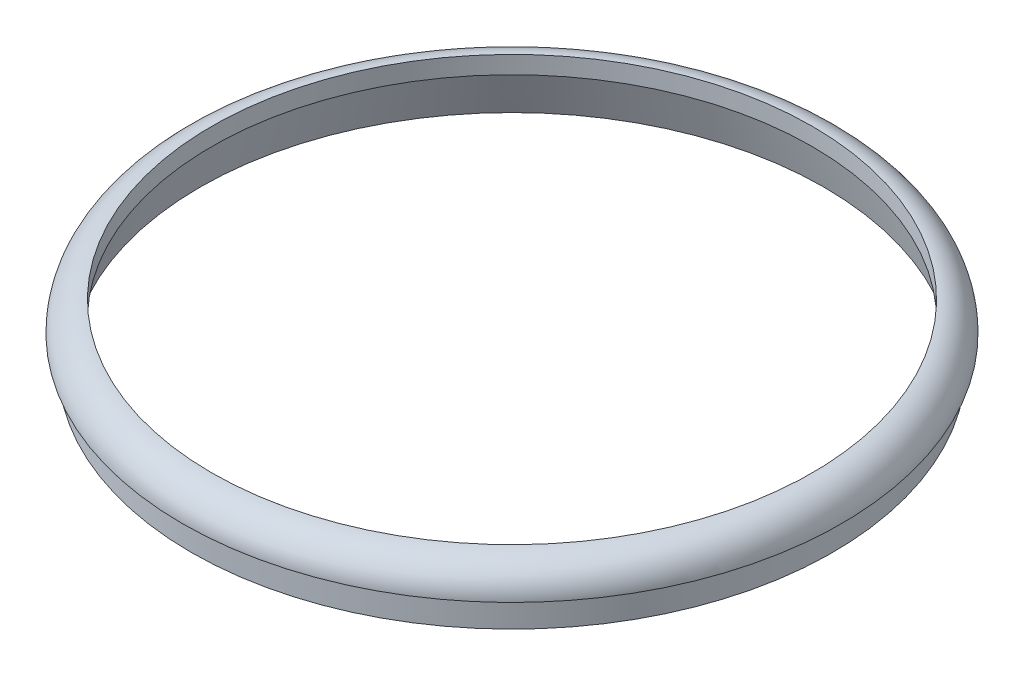
ISO-10303-21;
HEADER;
FILE_DESCRIPTION(('STEP AP214'),'2;1');
FILE_NAME('part.step','',(''),(''),'','','');
FILE_SCHEMA(('AUTOMOTIVE_DESIGN { 1 0 10303 214 1 1 1 1 }'));
ENDSEC;
DATA;
#1=APPLICATION_CONTEXT('core data for automotive mechanical design processes');
#2=APPLICATION_PROTOCOL_DEFINITION('international standard','automotive_design',2000,#1);
#3=PRODUCT_CONTEXT('',#1,'mechanical');
#4=PRODUCT('Part','Part','',(#3));
#5=PRODUCT_RELATED_PRODUCT_CATEGORY('part','',(#4));
#6=PRODUCT_DEFINITION_FORMATION('','',#4);
#7=PRODUCT_DEFINITION_CONTEXT('part definition',#1,'design');
#8=PRODUCT_DEFINITION('design','',#6,#7);
#9=PRODUCT_DEFINITION_SHAPE('','',#8);
#10=(LENGTH_UNIT() NAMED_UNIT(*) SI_UNIT(.MILLI.,.METRE.));
#11=(NAMED_UNIT(*) PLANE_ANGLE_UNIT() SI_UNIT($,.RADIAN.));
#12=(NAMED_UNIT(*) SI_UNIT($,.STERADIAN.) SOLID_ANGLE_UNIT());
#13=UNCERTAINTY_MEASURE_WITH_UNIT(LENGTH_MEASURE(1.E-05),#10,'distance_accuracy_value','');
#14=(GEOMETRIC_REPRESENTATION_CONTEXT(3) GLOBAL_UNCERTAINTY_ASSIGNED_CONTEXT((#13)) GLOBAL_UNIT_ASSIGNED_CONTEXT((#10,
#11,#12)) REPRESENTATION_CONTEXT('',''));
#15=CARTESIAN_POINT('',(0.,0.,0.));
#16=DIRECTION('',(0.,0.,1.));
#17=DIRECTION('',(1.,0.,0.));
#18=AXIS2_PLACEMENT_3D('',#15,#16,#17);
#19=CARTESIAN_POINT('',(0.,12.7,0.));
#20=DIRECTION('',(0.,1.,0.));
#21=DIRECTION('',(0.,0.,1.));
#22=AXIS2_PLACEMENT_3D('',#19,#20,#21);
#23=PLANE('',#22);
#24=CARTESIAN_POINT('',(0.,12.7,0.));
#25=DIRECTION('',(0.,1.,0.));
#26=DIRECTION('',(0.,0.,1.));
#27=AXIS2_PLACEMENT_3D('',#24,#25,#26);
#28=CIRCLE('',#27,142.71625);
#29=CARTESIAN_POINT('',(0.,12.7,142.71625));
#30=VERTEX_POINT('',#29);
#31=EDGE_CURVE('E10',#30,#30,#28,.T.);
#32=ORIENTED_EDGE('',*,*,#31,.F.);
#33=EDGE_LOOP('',(#32));
#34=FACE_BOUND('',#33,.T.);
#35=CARTESIAN_POINT('',(0.,12.7,0.));
#36=DIRECTION('',(0.,1.,0.));
#37=DIRECTION('',(0.,0.,1.));
#38=AXIS2_PLACEMENT_3D('',#35,#36,#37);
#39=CIRCLE('',#38,138.90625);
#40=CARTESIAN_POINT('',(0.,12.7,138.90625));
#41=VERTEX_POINT('',#40);
#42=EDGE_CURVE('E68',#41,#41,#39,.T.);
#43=ORIENTED_EDGE('',*,*,#42,.T.);
#44=EDGE_LOOP('',(#43));
#45=FACE_BOUND('',#44,.T.);
#46=ADVANCED_FACE('F41',(#34,#45),#23,.F.);
#47=CARTESIAN_POINT('',(0.,12.7,0.));
#48=DIRECTION('',(0.,1.,0.));
#49=DIRECTION('',(0.,0.,1.));
#50=AXIS2_PLACEMENT_3D('',#47,#48,#49);
#51=TOROIDAL_SURFACE('',#50,130.01625,12.7);
#52=CARTESIAN_POINT('',(0.,25.4,0.));
#53=DIRECTION('',(0.,1.,0.));
#54=DIRECTION('',(0.,0.,1.));
#55=AXIS2_PLACEMENT_3D('',#52,#53,#54);
#56=CIRCLE('',#55,130.01625);
#57=CARTESIAN_POINT('',(0.,25.4,130.01625));
#58=VERTEX_POINT('',#57);
#59=EDGE_CURVE('E48',#58,#58,#56,.T.);
#60=ORIENTED_EDGE('',*,*,#59,.F.);
#61=EDGE_LOOP('',(#60));
#62=FACE_BOUND('',#61,.T.);
#63=ORIENTED_EDGE('',*,*,#31,.T.);
#64=EDGE_LOOP('',(#63));
#65=FACE_BOUND('',#64,.T.);
#66=ADVANCED_FACE('F94',(#62,#65),#51,.T.);
#67=CARTESIAN_POINT('',(0.,164.388484839659,0.));
#68=DIRECTION('',(0.,1.,0.));
#69=DIRECTION('',(0.,0.,1.));
#70=AXIS2_PLACEMENT_3D('',#67,#68,#69);
#71=CYLINDRICAL_SURFACE('',#70,130.01625);
#72=CARTESIAN_POINT('',(0.,17.78,0.));
#73=DIRECTION('',(0.,1.,0.));
#74=DIRECTION('',(0.,0.,1.));
#75=AXIS2_PLACEMENT_3D('',#72,#73,#74);
#76=CIRCLE('',#75,130.01625);
#77=CARTESIAN_POINT('',(0.,17.78,130.01625));
#78=VERTEX_POINT('',#77);
#79=EDGE_CURVE('E53',#78,#78,#76,.T.);
#80=ORIENTED_EDGE('',*,*,#79,.F.);
#81=EDGE_LOOP('',(#80));
#82=FACE_BOUND('',#81,.T.);
#83=ORIENTED_EDGE('',*,*,#59,.T.);
#84=EDGE_LOOP('',(#83));
#85=FACE_BOUND('',#84,.T.);
#86=ADVANCED_FACE('F89',(#82,#85),#71,.F.);
#87=CARTESIAN_POINT('',(0.,17.78,0.));
#88=DIRECTION('',(0.,-1.,0.));
#89=DIRECTION('',(0.,0.,-1.));
#90=AXIS2_PLACEMENT_3D('',#87,#88,#89);
#91=CONICAL_SURFACE('',#90,130.01625,0.278299659005111);
#92=CARTESIAN_POINT('',(0.,0.,0.));
#93=DIRECTION('',(0.,1.,0.));
#94=DIRECTION('',(0.,0.,1.));
#95=AXIS2_PLACEMENT_3D('',#92,#93,#94);
#96=CIRCLE('',#95,135.09625);
#97=CARTESIAN_POINT('',(0.,0.,135.09625));
#98=VERTEX_POINT('',#97);
#99=EDGE_CURVE('E58',#98,#98,#96,.T.);
#100=ORIENTED_EDGE('',*,*,#99,.F.);
#101=EDGE_LOOP('',(#100));
#102=FACE_BOUND('',#101,.T.);
#103=ORIENTED_EDGE('',*,*,#79,.T.);
#104=EDGE_LOOP('',(#103));
#105=FACE_BOUND('',#104,.T.);
#106=ADVANCED_FACE('F83',(#102,#105),#91,.F.);
#107=CARTESIAN_POINT('',(0.,0.,0.));
#108=DIRECTION('',(0.,1.,0.));
#109=DIRECTION('',(0.,0.,1.));
#110=AXIS2_PLACEMENT_3D('',#107,#108,#109);
#111=PLANE('',#110);
#112=CARTESIAN_POINT('',(0.,0.,0.));
#113=DIRECTION('',(0.,1.,0.));
#114=DIRECTION('',(0.,0.,1.));
#115=AXIS2_PLACEMENT_3D('',#112,#113,#114);
#116=CIRCLE('',#115,138.90625);
#117=CARTESIAN_POINT('',(0.,0.,138.90625));
#118=VERTEX_POINT('',#117);
#119=EDGE_CURVE('E64',#118,#118,#116,.T.);
#120=ORIENTED_EDGE('',*,*,#119,.F.);
#121=EDGE_LOOP('',(#120));
#122=FACE_BOUND('',#121,.T.);
#123=ORIENTED_EDGE('',*,*,#99,.T.);
#124=EDGE_LOOP('',(#123));
#125=FACE_BOUND('',#124,.T.);
#126=ADVANCED_FACE('F77',(#122,#125),#111,.F.);
#127=CARTESIAN_POINT('',(0.,164.388484839659,0.));
#128=DIRECTION('',(0.,1.,0.));
#129=DIRECTION('',(0.,0.,1.));
#130=AXIS2_PLACEMENT_3D('',#127,#128,#129);
#131=CYLINDRICAL_SURFACE('',#130,138.90625);
#132=ORIENTED_EDGE('',*,*,#42,.F.);
#133=EDGE_LOOP('',(#132));
#134=FACE_BOUND('',#133,.T.);
#135=ORIENTED_EDGE('',*,*,#119,.T.);
#136=EDGE_LOOP('',(#135));
#137=FACE_BOUND('',#136,.T.);
#138=ADVANCED_FACE('F74',(#134,#137),#131,.T.);
#139=CLOSED_SHELL('',(#46,#66,#86,#106,#126,#138));
#140=MANIFOLD_SOLID_BREP('B2',#139);
#141=ADVANCED_BREP_SHAPE_REPRESENTATION('',(#18,#140),#14);
#142=SHAPE_DEFINITION_REPRESENTATION(#9,#141);
ENDSEC;
END-ISO-10303-21;
